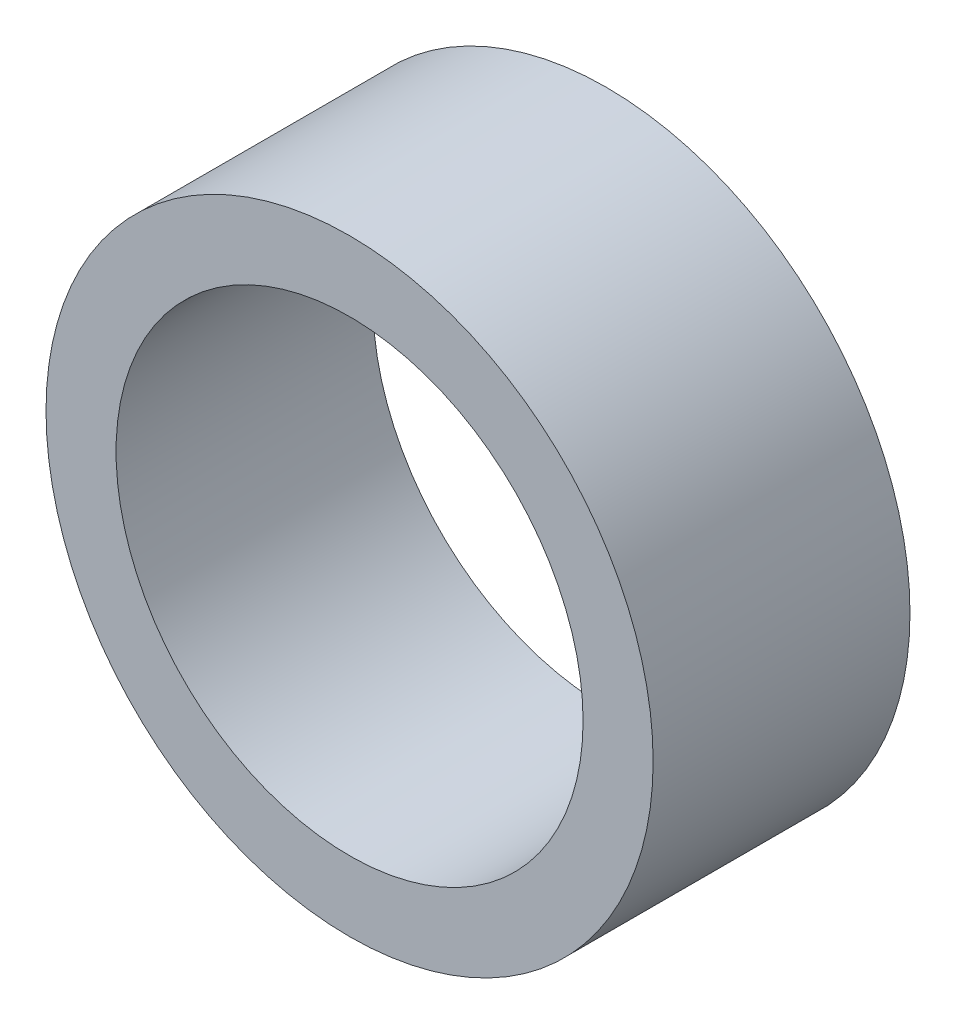
ISO-10303-21;
HEADER;
FILE_DESCRIPTION(('STEP AP214'),'2;1');
FILE_NAME('part.step','',(''),(''),'','','');
FILE_SCHEMA(('AUTOMOTIVE_DESIGN { 1 0 10303 214 1 1 1 1 }'));
ENDSEC;
DATA;
#1=APPLICATION_CONTEXT('core data for automotive mechanical design processes');
#2=APPLICATION_PROTOCOL_DEFINITION('international standard','automotive_design',2000,#1);
#3=PRODUCT_CONTEXT('',#1,'mechanical');
#4=PRODUCT('Part','Part','',(#3));
#5=PRODUCT_RELATED_PRODUCT_CATEGORY('part','',(#4));
#6=PRODUCT_DEFINITION_FORMATION('','',#4);
#7=PRODUCT_DEFINITION_CONTEXT('part definition',#1,'design');
#8=PRODUCT_DEFINITION('design','',#6,#7);
#9=PRODUCT_DEFINITION_SHAPE('','',#8);
#10=(LENGTH_UNIT() NAMED_UNIT(*) SI_UNIT(.MILLI.,.METRE.));
#11=(NAMED_UNIT(*) PLANE_ANGLE_UNIT() SI_UNIT($,.RADIAN.));
#12=(NAMED_UNIT(*) SI_UNIT($,.STERADIAN.) SOLID_ANGLE_UNIT());
#13=UNCERTAINTY_MEASURE_WITH_UNIT(LENGTH_MEASURE(1.E-05),#10,'distance_accuracy_value','');
#14=(GEOMETRIC_REPRESENTATION_CONTEXT(3) GLOBAL_UNCERTAINTY_ASSIGNED_CONTEXT((#13)) GLOBAL_UNIT_ASSIGNED_CONTEXT((#10,
#11,#12)) REPRESENTATION_CONTEXT('',''));
#15=CARTESIAN_POINT('',(0.,0.,0.));
#16=DIRECTION('',(0.,0.,1.));
#17=DIRECTION('',(1.,0.,0.));
#18=AXIS2_PLACEMENT_3D('',#15,#16,#17);
#19=CARTESIAN_POINT('',(0.,0.,5.5));
#20=DIRECTION('',(0.,0.,1.));
#21=DIRECTION('',(1.,0.,0.));
#22=AXIS2_PLACEMENT_3D('',#19,#20,#21);
#23=PLANE('',#22);
#24=CARTESIAN_POINT('',(0.,0.,5.5));
#25=DIRECTION('',(0.,0.,1.));
#26=DIRECTION('',(1.,0.,0.));
#27=AXIS2_PLACEMENT_3D('',#24,#25,#26);
#28=CIRCLE('',#27,6.5);
#29=CARTESIAN_POINT('',(6.5,0.,5.5));
#30=VERTEX_POINT('',#29);
#31=EDGE_CURVE('E10',#30,#30,#28,.T.);
#32=ORIENTED_EDGE('',*,*,#31,.T.);
#33=EDGE_LOOP('',(#32));
#34=FACE_BOUND('',#33,.T.);
#35=CARTESIAN_POINT('',(0.,0.,5.5));
#36=DIRECTION('',(0.,0.,1.));
#37=DIRECTION('',(1.,0.,0.));
#38=AXIS2_PLACEMENT_3D('',#35,#36,#37);
#39=CIRCLE('',#38,5.);
#40=CARTESIAN_POINT('',(5.,0.,5.5));
#41=VERTEX_POINT('',#40);
#42=EDGE_CURVE('E48',#41,#41,#39,.T.);
#43=ORIENTED_EDGE('',*,*,#42,.F.);
#44=EDGE_LOOP('',(#43));
#45=FACE_BOUND('',#44,.T.);
#46=ADVANCED_FACE('F37',(#34,#45),#23,.T.);
#47=CARTESIAN_POINT('',(0.,0.,0.));
#48=DIRECTION('',(0.,0.,1.));
#49=DIRECTION('',(1.,0.,0.));
#50=AXIS2_PLACEMENT_3D('',#47,#48,#49);
#51=PLANE('',#50);
#52=CARTESIAN_POINT('',(0.,0.,0.));
#53=DIRECTION('',(0.,0.,1.));
#54=DIRECTION('',(1.,0.,0.));
#55=AXIS2_PLACEMENT_3D('',#52,#53,#54);
#56=CIRCLE('',#55,6.5);
#57=CARTESIAN_POINT('',(6.5,0.,0.));
#58=VERTEX_POINT('',#57);
#59=EDGE_CURVE('E41',#58,#58,#56,.T.);
#60=ORIENTED_EDGE('',*,*,#59,.F.);
#61=EDGE_LOOP('',(#60));
#62=FACE_BOUND('',#61,.T.);
#63=CARTESIAN_POINT('',(0.,0.,0.));
#64=DIRECTION('',(0.,0.,1.));
#65=DIRECTION('',(1.,0.,0.));
#66=AXIS2_PLACEMENT_3D('',#63,#64,#65);
#67=CIRCLE('',#66,5.);
#68=CARTESIAN_POINT('',(5.,0.,0.));
#69=VERTEX_POINT('',#68);
#70=EDGE_CURVE('E50',#69,#69,#67,.T.);
#71=ORIENTED_EDGE('',*,*,#70,.T.);
#72=EDGE_LOOP('',(#71));
#73=FACE_BOUND('',#72,.T.);
#74=ADVANCED_FACE('F60',(#62,#73),#51,.F.);
#75=CARTESIAN_POINT('',(0.,0.,5.5));
#76=DIRECTION('',(0.,0.,-1.));
#77=DIRECTION('',(-1.,0.,0.));
#78=AXIS2_PLACEMENT_3D('',#75,#76,#77);
#79=CYLINDRICAL_SURFACE('',#78,6.5);
#80=ORIENTED_EDGE('',*,*,#31,.F.);
#81=EDGE_LOOP('',(#80));
#82=FACE_BOUND('',#81,.T.);
#83=ORIENTED_EDGE('',*,*,#59,.T.);
#84=EDGE_LOOP('',(#83));
#85=FACE_BOUND('',#84,.T.);
#86=ADVANCED_FACE('F39',(#82,#85),#79,.T.);
#87=CARTESIAN_POINT('',(0.,0.,5.5));
#88=DIRECTION('',(0.,0.,-1.));
#89=DIRECTION('',(-1.,0.,0.));
#90=AXIS2_PLACEMENT_3D('',#87,#88,#89);
#91=CYLINDRICAL_SURFACE('',#90,5.);
#92=ORIENTED_EDGE('',*,*,#42,.T.);
#93=EDGE_LOOP('',(#92));
#94=FACE_BOUND('',#93,.T.);
#95=ORIENTED_EDGE('',*,*,#70,.F.);
#96=EDGE_LOOP('',(#95));
#97=FACE_BOUND('',#96,.T.);
#98=ADVANCED_FACE('F56',(#94,#97),#91,.F.);
#99=CLOSED_SHELL('',(#46,#74,#86,#98));
#100=MANIFOLD_SOLID_BREP('B2',#99);
#101=ADVANCED_BREP_SHAPE_REPRESENTATION('',(#18,#100),#14);
#102=SHAPE_DEFINITION_REPRESENTATION(#9,#101);
ENDSEC;
END-ISO-10303-21;
